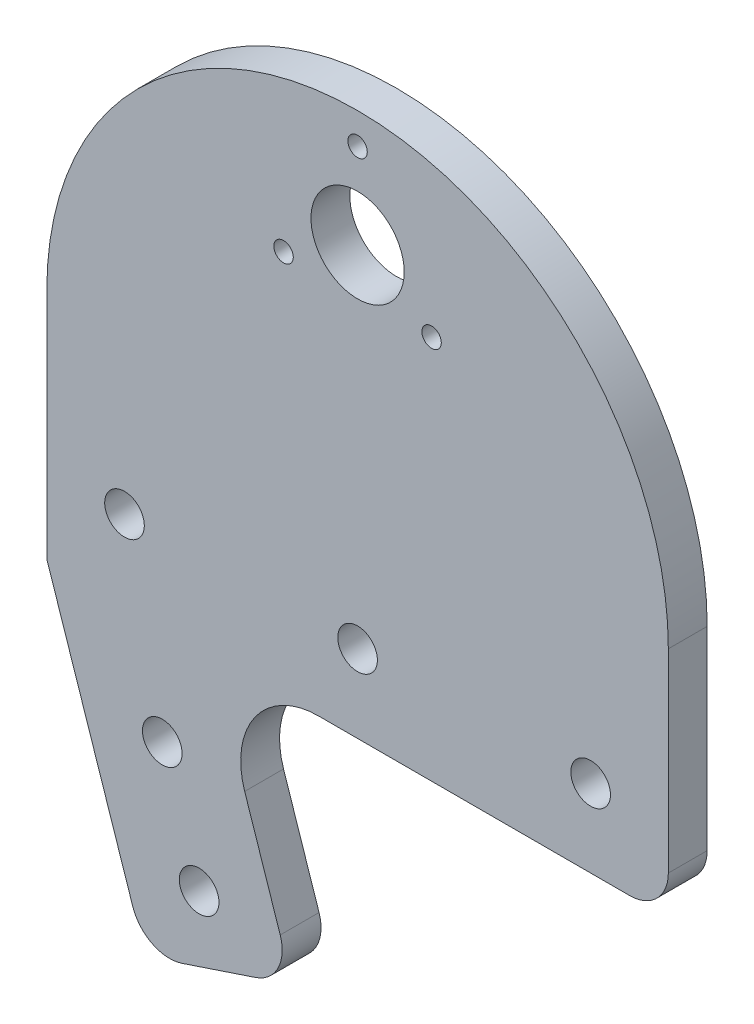
ISO-10303-21;
HEADER;
FILE_DESCRIPTION(('STEP AP214'),'2;1');
FILE_NAME('part.step','',(''),(''),'','','');
FILE_SCHEMA(('AUTOMOTIVE_DESIGN { 1 0 10303 214 1 1 1 1 }'));
ENDSEC;
DATA;
#1=APPLICATION_CONTEXT('core data for automotive mechanical design processes');
#2=APPLICATION_PROTOCOL_DEFINITION('international standard','automotive_design',2000,#1);
#3=PRODUCT_CONTEXT('',#1,'mechanical');
#4=PRODUCT('Part','Part','',(#3));
#5=PRODUCT_RELATED_PRODUCT_CATEGORY('part','',(#4));
#6=PRODUCT_DEFINITION_FORMATION('','',#4);
#7=PRODUCT_DEFINITION_CONTEXT('part definition',#1,'design');
#8=PRODUCT_DEFINITION('design','',#6,#7);
#9=PRODUCT_DEFINITION_SHAPE('','',#8);
#10=(LENGTH_UNIT() NAMED_UNIT(*) SI_UNIT(.MILLI.,.METRE.));
#11=(NAMED_UNIT(*) PLANE_ANGLE_UNIT() SI_UNIT($,.RADIAN.));
#12=(NAMED_UNIT(*) SI_UNIT($,.STERADIAN.) SOLID_ANGLE_UNIT());
#13=UNCERTAINTY_MEASURE_WITH_UNIT(LENGTH_MEASURE(1.E-05),#10,'distance_accuracy_value','');
#14=(GEOMETRIC_REPRESENTATION_CONTEXT(3) GLOBAL_UNCERTAINTY_ASSIGNED_CONTEXT((#13)) GLOBAL_UNIT_ASSIGNED_CONTEXT((#10,
#11,#12)) REPRESENTATION_CONTEXT('',''));
#15=CARTESIAN_POINT('',(0.,0.,0.));
#16=DIRECTION('',(0.,0.,1.));
#17=DIRECTION('',(1.,0.,0.));
#18=AXIS2_PLACEMENT_3D('',#15,#16,#17);
#19=CARTESIAN_POINT('',(-40.,-55.,5.));
#20=DIRECTION('',(0.,1.,0.));
#21=DIRECTION('',(-1.,0.,0.));
#22=AXIS2_PLACEMENT_3D('',#19,#20,#21);
#23=PLANE('',#22);
#24=DIRECTION('',(1.,0.,0.));
#25=VECTOR('',#24,1.);
#26=CARTESIAN_POINT('',(-40.,-55.,0.));
#27=LINE('',#26,#25);
#28=CARTESIAN_POINT('',(-5.04389006498376,-55.,0.));
#29=VERTEX_POINT('',#28);
#30=CARTESIAN_POINT('',(35.,-55.,0.));
#31=VERTEX_POINT('',#30);
#32=EDGE_CURVE('E207',#29,#31,#27,.T.);
#33=ORIENTED_EDGE('',*,*,#32,.T.);
#34=DIRECTION('',(0.,0.,-1.));
#35=VECTOR('',#34,1.);
#36=CARTESIAN_POINT('',(35.,-55.,5.));
#37=LINE('',#36,#35);
#38=CARTESIAN_POINT('',(35.,-55.,5.));
#39=VERTEX_POINT('',#38);
#40=EDGE_CURVE('E234',#31,#39,#37,.F.);
#41=ORIENTED_EDGE('',*,*,#40,.T.);
#42=DIRECTION('',(1.,0.,0.));
#43=VECTOR('',#42,1.);
#44=CARTESIAN_POINT('',(-40.,-55.,5.));
#45=LINE('',#44,#43);
#46=CARTESIAN_POINT('',(-5.04389006498376,-55.,5.));
#47=VERTEX_POINT('',#46);
#48=EDGE_CURVE('E132',#47,#39,#45,.T.);
#49=ORIENTED_EDGE('',*,*,#48,.F.);
#50=DIRECTION('',(0.,0.,1.));
#51=VECTOR('',#50,1.);
#52=CARTESIAN_POINT('',(-5.04389006498376,-55.,5.));
#53=LINE('',#52,#51);
#54=EDGE_CURVE('E218',#47,#29,#53,.F.);
#55=ORIENTED_EDGE('',*,*,#54,.T.);
#56=EDGE_LOOP('',(#33,#41,#49,#55));
#57=FACE_BOUND('',#56,.T.);
#58=ADVANCED_FACE('F38',(#57),#23,.F.);
#59=CARTESIAN_POINT('',(0.,-25.,5.));
#60=DIRECTION('',(0.,0.,-1.));
#61=DIRECTION('',(-1.,0.,0.));
#62=AXIS2_PLACEMENT_3D('',#59,#60,#61);
#63=PLANE('',#62);
#64=CARTESIAN_POINT('',(0.,11.,5.));
#65=DIRECTION('',(0.,0.,1.));
#66=DIRECTION('',(1.,0.,0.));
#67=AXIS2_PLACEMENT_3D('',#64,#65,#66);
#68=CIRCLE('',#67,1.25);
#69=CARTESIAN_POINT('',(1.25,11.,5.));
#70=VERTEX_POINT('',#69);
#71=EDGE_CURVE('E362',#70,#70,#68,.T.);
#72=ORIENTED_EDGE('',*,*,#71,.F.);
#73=EDGE_LOOP('',(#72));
#74=FACE_BOUND('',#73,.T.);
#75=CARTESIAN_POINT('',(9.52627944162906,-5.49999999999986,5.));
#76=DIRECTION('',(0.,0.,1.));
#77=DIRECTION('',(1.,0.,0.));
#78=AXIS2_PLACEMENT_3D('',#75,#76,#77);
#79=CIRCLE('',#78,1.25000000000024);
#80=CARTESIAN_POINT('',(10.7762794416293,-5.49999999999986,5.));
#81=VERTEX_POINT('',#80);
#82=EDGE_CURVE('E367',#81,#81,#79,.T.);
#83=ORIENTED_EDGE('',*,*,#82,.F.);
#84=EDGE_LOOP('',(#83));
#85=FACE_BOUND('',#84,.T.);
#86=CARTESIAN_POINT('',(-9.52627944162859,-5.50000000000014,5.));
#87=DIRECTION('',(0.,0.,1.));
#88=DIRECTION('',(1.,0.,0.));
#89=AXIS2_PLACEMENT_3D('',#86,#87,#88);
#90=CIRCLE('',#89,1.25000000000036);
#91=CARTESIAN_POINT('',(-8.27627944162823,-5.50000000000014,5.));
#92=VERTEX_POINT('',#91);
#93=EDGE_CURVE('E157',#92,#92,#90,.T.);
#94=ORIENTED_EDGE('',*,*,#93,.F.);
#95=EDGE_LOOP('',(#94));
#96=FACE_BOUND('',#95,.T.);
#97=ORIENTED_EDGE('',*,*,#48,.T.);
#98=CARTESIAN_POINT('',(35.,-50.,5.));
#99=DIRECTION('',(0.,0.,-1.));
#100=DIRECTION('',(-1.,0.,0.));
#101=AXIS2_PLACEMENT_3D('',#98,#99,#100);
#102=CIRCLE('',#101,5.);
#103=CARTESIAN_POINT('',(40.,-50.,5.));
#104=VERTEX_POINT('',#103);
#105=EDGE_CURVE('E239',#39,#104,#102,.F.);
#106=ORIENTED_EDGE('',*,*,#105,.T.);
#107=DIRECTION('',(0.,1.,0.));
#108=VECTOR('',#107,1.);
#109=CARTESIAN_POINT('',(40.,-25.,5.));
#110=LINE('',#109,#108);
#111=CARTESIAN_POINT('',(40.,-25.,5.));
#112=VERTEX_POINT('',#111);
#113=EDGE_CURVE('E202',#104,#112,#110,.T.);
#114=ORIENTED_EDGE('',*,*,#113,.T.);
#115=CARTESIAN_POINT('',(0.,-25.,5.));
#116=DIRECTION('',(0.,0.,1.));
#117=DIRECTION('',(-1.,0.,0.));
#118=AXIS2_PLACEMENT_3D('',#115,#116,#117);
#119=CIRCLE('',#118,40.);
#120=CARTESIAN_POINT('',(-40.,-25.,5.));
#121=VERTEX_POINT('',#120);
#122=EDGE_CURVE('E128',#112,#121,#119,.T.);
#123=ORIENTED_EDGE('',*,*,#122,.T.);
#124=DIRECTION('',(0.,-1.,0.));
#125=VECTOR('',#124,1.);
#126=CARTESIAN_POINT('',(-40.,-25.,5.));
#127=LINE('',#126,#125);
#128=CARTESIAN_POINT('',(-40.,-55.,5.));
#129=VERTEX_POINT('',#128);
#130=EDGE_CURVE('E120',#121,#129,#127,.T.);
#131=ORIENTED_EDGE('',*,*,#130,.T.);
#132=DIRECTION('',(0.31622776601683,-0.948683298050516,0.));
#133=VECTOR('',#132,1.);
#134=CARTESIAN_POINT('',(-27.3508893593268,-92.9473319220206,5.));
#135=LINE('',#134,#133);
#136=CARTESIAN_POINT('',(-28.932028189411,-88.203915431768,5.));
#137=VERTEX_POINT('',#136);
#138=EDGE_CURVE('E126',#129,#137,#135,.T.);
#139=ORIENTED_EDGE('',*,*,#138,.T.);
#140=CARTESIAN_POINT('',(-24.1886116991584,-86.6227766016839,5.));
#141=DIRECTION('',(0.,0.,-1.));
#142=DIRECTION('',(-1.,0.,0.));
#143=AXIS2_PLACEMENT_3D('',#140,#141,#142);
#144=CIRCLE('',#143,5.);
#145=CARTESIAN_POINT('',(-22.6074728690742,-91.3661930919364,5.));
#146=VERTEX_POINT('',#145);
#147=EDGE_CURVE('E236',#137,#146,#144,.F.);
#148=ORIENTED_EDGE('',*,*,#147,.T.);
#149=DIRECTION('',(0.948683298050514,0.316227766016837,0.));
#150=VECTOR('',#149,1.);
#151=CARTESIAN_POINT('',(-27.3508893593268,-92.9473319220206,5.));
#152=LINE('',#151,#150);
#153=CARTESIAN_POINT('',(-13.1206398885696,-88.2039154317683,5.));
#154=VERTEX_POINT('',#153);
#155=EDGE_CURVE('E154',#146,#154,#152,.T.);
#156=ORIENTED_EDGE('',*,*,#155,.T.);
#157=CARTESIAN_POINT('',(-14.7017787186538,-83.4604989415157,5.));
#158=DIRECTION('',(0.,0.,-1.));
#159=DIRECTION('',(-1.,0.,0.));
#160=AXIS2_PLACEMENT_3D('',#157,#158,#159);
#161=CIRCLE('',#160,5.);
#162=CARTESIAN_POINT('',(-9.95836222840121,-81.8793601114315,5.));
#163=VERTEX_POINT('',#162);
#164=EDGE_CURVE('E53',#154,#163,#161,.F.);
#165=ORIENTED_EDGE('',*,*,#164,.T.);
#166=DIRECTION('',(-0.316227766016837,0.948683298050514,0.));
#167=VECTOR('',#166,1.);
#168=CARTESIAN_POINT('',(-8.37722339831702,-86.6227766016841,5.));
#169=LINE('',#168,#167);
#170=CARTESIAN_POINT('',(-14.5307230454889,-68.1622776601683,5.));
#171=VERTEX_POINT('',#170);
#172=EDGE_CURVE('E149',#163,#171,#169,.T.);
#173=ORIENTED_EDGE('',*,*,#172,.T.);
#174=CARTESIAN_POINT('',(-5.04389006498377,-65.,5.));
#175=DIRECTION('',(0.,0.,-1.));
#176=DIRECTION('',(-1.,0.,0.));
#177=AXIS2_PLACEMENT_3D('',#174,#175,#176);
#178=CIRCLE('',#177,10.);
#179=EDGE_CURVE('E220',#171,#47,#178,.T.);
#180=ORIENTED_EDGE('',*,*,#179,.T.);
#181=EDGE_LOOP('',(#97,#106,#114,#123,#131,#139,#148,#156,#165,#173,#180));
#182=FACE_BOUND('',#181,.T.);
#183=CARTESIAN_POINT('',(0.,0.,5.));
#184=DIRECTION('',(0.,0.,1.));
#185=DIRECTION('',(1.,0.,0.));
#186=AXIS2_PLACEMENT_3D('',#183,#184,#185);
#187=CIRCLE('',#186,6.);
#188=CARTESIAN_POINT('',(6.,0.,5.));
#189=VERTEX_POINT('',#188);
#190=EDGE_CURVE('E196',#189,#189,#187,.T.);
#191=ORIENTED_EDGE('',*,*,#190,.F.);
#192=EDGE_LOOP('',(#191));
#193=FACE_BOUND('',#192,.T.);
#194=CARTESIAN_POINT('',(0.,-45.,5.));
#195=DIRECTION('',(0.,0.,1.));
#196=DIRECTION('',(1.,0.,0.));
#197=AXIS2_PLACEMENT_3D('',#194,#195,#196);
#198=CIRCLE('',#197,2.55);
#199=CARTESIAN_POINT('',(2.55000000000001,-45.,5.));
#200=VERTEX_POINT('',#199);
#201=EDGE_CURVE('E190',#200,#200,#198,.T.);
#202=ORIENTED_EDGE('',*,*,#201,.F.);
#203=EDGE_LOOP('',(#202));
#204=FACE_BOUND('',#203,.T.);
#205=CARTESIAN_POINT('',(-30.,-45.,5.));
#206=DIRECTION('',(0.,0.,1.));
#207=DIRECTION('',(1.,0.,0.));
#208=AXIS2_PLACEMENT_3D('',#205,#206,#207);
#209=CIRCLE('',#208,2.54999999999999);
#210=CARTESIAN_POINT('',(-27.45,-45.,5.));
#211=VERTEX_POINT('',#210);
#212=EDGE_CURVE('E184',#211,#211,#209,.T.);
#213=ORIENTED_EDGE('',*,*,#212,.F.);
#214=EDGE_LOOP('',(#213));
#215=FACE_BOUND('',#214,.T.);
#216=CARTESIAN_POINT('',(30.,-45.,5.));
#217=DIRECTION('',(0.,0.,1.));
#218=DIRECTION('',(1.,0.,0.));
#219=AXIS2_PLACEMENT_3D('',#216,#217,#218);
#220=CIRCLE('',#219,2.55);
#221=CARTESIAN_POINT('',(32.55,-45.,5.));
#222=VERTEX_POINT('',#221);
#223=EDGE_CURVE('E178',#222,#222,#220,.T.);
#224=ORIENTED_EDGE('',*,*,#223,.F.);
#225=EDGE_LOOP('',(#224));
#226=FACE_BOUND('',#225,.T.);
#227=CARTESIAN_POINT('',(-25.1372949972092,-67.9653384066905,5.));
#228=DIRECTION('',(0.,0.,1.));
#229=DIRECTION('',(1.,0.,0.));
#230=AXIS2_PLACEMENT_3D('',#227,#228,#229);
#231=CIRCLE('',#230,2.54999999999999);
#232=CARTESIAN_POINT('',(-22.5872949972092,-67.9653384066905,5.));
#233=VERTEX_POINT('',#232);
#234=EDGE_CURVE('E161',#233,#233,#231,.T.);
#235=ORIENTED_EDGE('',*,*,#234,.F.);
#236=EDGE_LOOP('',(#235));
#237=FACE_BOUND('',#236,.T.);
#238=CARTESIAN_POINT('',(-20.3938785069566,-82.1955878774482,5.));
#239=DIRECTION('',(0.,0.,1.));
#240=DIRECTION('',(1.,0.,0.));
#241=AXIS2_PLACEMENT_3D('',#238,#239,#240);
#242=CIRCLE('',#241,2.54999999999999);
#243=CARTESIAN_POINT('',(-17.8438785069566,-82.1955878774482,5.));
#244=VERTEX_POINT('',#243);
#245=EDGE_CURVE('E162',#244,#244,#242,.T.);
#246=ORIENTED_EDGE('',*,*,#245,.F.);
#247=EDGE_LOOP('',(#246));
#248=FACE_BOUND('',#247,.T.);
#249=ADVANCED_FACE('F123',(#74,#85,#96,#182,#193,#204,#215,#226,#237,#248),#63,.F.);
#250=CARTESIAN_POINT('',(0.,-25.,0.));
#251=DIRECTION('',(0.,0.,-1.));
#252=DIRECTION('',(-1.,0.,0.));
#253=AXIS2_PLACEMENT_3D('',#250,#251,#252);
#254=PLANE('',#253);
#255=CARTESIAN_POINT('',(0.,11.,0.));
#256=DIRECTION('',(0.,0.,1.));
#257=DIRECTION('',(1.,0.,0.));
#258=AXIS2_PLACEMENT_3D('',#255,#256,#257);
#259=CIRCLE('',#258,1.25);
#260=CARTESIAN_POINT('',(1.25,11.,0.));
#261=VERTEX_POINT('',#260);
#262=EDGE_CURVE('E176',#261,#261,#259,.T.);
#263=ORIENTED_EDGE('',*,*,#262,.T.);
#264=EDGE_LOOP('',(#263));
#265=FACE_BOUND('',#264,.T.);
#266=CARTESIAN_POINT('',(9.52627944162906,-5.49999999999986,0.));
#267=DIRECTION('',(0.,0.,1.));
#268=DIRECTION('',(1.,0.,0.));
#269=AXIS2_PLACEMENT_3D('',#266,#267,#268);
#270=CIRCLE('',#269,1.25000000000024);
#271=CARTESIAN_POINT('',(10.7762794416293,-5.49999999999986,0.));
#272=VERTEX_POINT('',#271);
#273=EDGE_CURVE('E363',#272,#272,#270,.T.);
#274=ORIENTED_EDGE('',*,*,#273,.T.);
#275=EDGE_LOOP('',(#274));
#276=FACE_BOUND('',#275,.T.);
#277=CARTESIAN_POINT('',(-9.52627944162859,-5.50000000000014,0.));
#278=DIRECTION('',(0.,0.,1.));
#279=DIRECTION('',(1.,0.,0.));
#280=AXIS2_PLACEMENT_3D('',#277,#278,#279);
#281=CIRCLE('',#280,1.25000000000036);
#282=CARTESIAN_POINT('',(-8.27627944162823,-5.50000000000014,0.));
#283=VERTEX_POINT('',#282);
#284=EDGE_CURVE('E371',#283,#283,#281,.T.);
#285=ORIENTED_EDGE('',*,*,#284,.T.);
#286=EDGE_LOOP('',(#285));
#287=FACE_BOUND('',#286,.T.);
#288=CARTESIAN_POINT('',(-30.,-45.,0.));
#289=DIRECTION('',(0.,0.,1.));
#290=DIRECTION('',(1.,0.,0.));
#291=AXIS2_PLACEMENT_3D('',#288,#289,#290);
#292=CIRCLE('',#291,2.54999999999999);
#293=CARTESIAN_POINT('',(-27.45,-45.,0.));
#294=VERTEX_POINT('',#293);
#295=EDGE_CURVE('E181',#294,#294,#292,.T.);
#296=ORIENTED_EDGE('',*,*,#295,.T.);
#297=EDGE_LOOP('',(#296));
#298=FACE_BOUND('',#297,.T.);
#299=CARTESIAN_POINT('',(0.,0.,0.));
#300=DIRECTION('',(0.,0.,1.));
#301=DIRECTION('',(1.,0.,0.));
#302=AXIS2_PLACEMENT_3D('',#299,#300,#301);
#303=CIRCLE('',#302,6.);
#304=CARTESIAN_POINT('',(6.,0.,0.));
#305=VERTEX_POINT('',#304);
#306=EDGE_CURVE('E193',#305,#305,#303,.T.);
#307=ORIENTED_EDGE('',*,*,#306,.T.);
#308=EDGE_LOOP('',(#307));
#309=FACE_BOUND('',#308,.T.);
#310=DIRECTION('',(0.,1.,0.));
#311=VECTOR('',#310,1.);
#312=CARTESIAN_POINT('',(40.,-25.,0.));
#313=LINE('',#312,#311);
#314=CARTESIAN_POINT('',(40.,-50.,0.));
#315=VERTEX_POINT('',#314);
#316=CARTESIAN_POINT('',(40.,-25.,0.));
#317=VERTEX_POINT('',#316);
#318=EDGE_CURVE('E210',#315,#317,#313,.T.);
#319=ORIENTED_EDGE('',*,*,#318,.F.);
#320=CARTESIAN_POINT('',(35.,-50.,0.));
#321=DIRECTION('',(0.,0.,-1.));
#322=DIRECTION('',(-1.,0.,0.));
#323=AXIS2_PLACEMENT_3D('',#320,#321,#322);
#324=CIRCLE('',#323,5.);
#325=EDGE_CURVE('E232',#315,#31,#324,.T.);
#326=ORIENTED_EDGE('',*,*,#325,.T.);
#327=ORIENTED_EDGE('',*,*,#32,.F.);
#328=CARTESIAN_POINT('',(-5.04389006498377,-65.,0.));
#329=DIRECTION('',(0.,0.,-1.));
#330=DIRECTION('',(-1.,0.,0.));
#331=AXIS2_PLACEMENT_3D('',#328,#329,#330);
#332=CIRCLE('',#331,10.);
#333=CARTESIAN_POINT('',(-14.5307230454889,-68.1622776601683,0.));
#334=VERTEX_POINT('',#333);
#335=EDGE_CURVE('E222',#29,#334,#332,.F.);
#336=ORIENTED_EDGE('',*,*,#335,.T.);
#337=DIRECTION('',(-0.316227766016837,0.948683298050514,0.));
#338=VECTOR('',#337,1.);
#339=CARTESIAN_POINT('',(-8.37722339831702,-86.6227766016841,0.));
#340=LINE('',#339,#338);
#341=CARTESIAN_POINT('',(-9.95836222840121,-81.8793601114315,0.));
#342=VERTEX_POINT('',#341);
#343=EDGE_CURVE('E165',#342,#334,#340,.T.);
#344=ORIENTED_EDGE('',*,*,#343,.F.);
#345=CARTESIAN_POINT('',(-14.7017787186538,-83.4604989415157,0.));
#346=DIRECTION('',(0.,0.,-1.));
#347=DIRECTION('',(-1.,0.,0.));
#348=AXIS2_PLACEMENT_3D('',#345,#346,#347);
#349=CIRCLE('',#348,5.);
#350=CARTESIAN_POINT('',(-13.1206398885696,-88.2039154317683,0.));
#351=VERTEX_POINT('',#350);
#352=EDGE_CURVE('E230',#342,#351,#349,.T.);
#353=ORIENTED_EDGE('',*,*,#352,.T.);
#354=DIRECTION('',(0.948683298050514,0.316227766016837,0.));
#355=VECTOR('',#354,1.);
#356=CARTESIAN_POINT('',(-27.3508893593268,-92.9473319220206,0.));
#357=LINE('',#356,#355);
#358=CARTESIAN_POINT('',(-22.6074728690742,-91.3661930919364,0.));
#359=VERTEX_POINT('',#358);
#360=EDGE_CURVE('E173',#359,#351,#357,.T.);
#361=ORIENTED_EDGE('',*,*,#360,.F.);
#362=CARTESIAN_POINT('',(-24.1886116991584,-86.6227766016839,0.));
#363=DIRECTION('',(0.,0.,-1.));
#364=DIRECTION('',(-1.,0.,0.));
#365=AXIS2_PLACEMENT_3D('',#362,#363,#364);
#366=CIRCLE('',#365,5.);
#367=CARTESIAN_POINT('',(-28.932028189411,-88.203915431768,0.));
#368=VERTEX_POINT('',#367);
#369=EDGE_CURVE('E228',#359,#368,#366,.T.);
#370=ORIENTED_EDGE('',*,*,#369,.T.);
#371=DIRECTION('',(0.31622776601683,-0.948683298050517,0.));
#372=VECTOR('',#371,1.);
#373=CARTESIAN_POINT('',(-27.3508893593268,-92.9473319220206,0.));
#374=LINE('',#373,#372);
#375=CARTESIAN_POINT('',(-40.,-55.,0.));
#376=VERTEX_POINT('',#375);
#377=EDGE_CURVE('E172',#376,#368,#374,.T.);
#378=ORIENTED_EDGE('',*,*,#377,.F.);
#379=DIRECTION('',(0.,-1.,0.));
#380=VECTOR('',#379,1.);
#381=CARTESIAN_POINT('',(-40.,-25.,0.));
#382=LINE('',#381,#380);
#383=CARTESIAN_POINT('',(-40.,-25.,0.));
#384=VERTEX_POINT('',#383);
#385=EDGE_CURVE('E139',#384,#376,#382,.T.);
#386=ORIENTED_EDGE('',*,*,#385,.F.);
#387=CARTESIAN_POINT('',(0.,-25.,0.));
#388=DIRECTION('',(0.,0.,1.));
#389=DIRECTION('',(-1.,0.,0.));
#390=AXIS2_PLACEMENT_3D('',#387,#388,#389);
#391=CIRCLE('',#390,40.);
#392=EDGE_CURVE('E133',#317,#384,#391,.T.);
#393=ORIENTED_EDGE('',*,*,#392,.F.);
#394=EDGE_LOOP('',(#319,#326,#327,#336,#344,#353,#361,#370,#378,#386,#393));
#395=FACE_BOUND('',#394,.T.);
#396=CARTESIAN_POINT('',(0.,-45.,0.));
#397=DIRECTION('',(0.,0.,1.));
#398=DIRECTION('',(1.,0.,0.));
#399=AXIS2_PLACEMENT_3D('',#396,#397,#398);
#400=CIRCLE('',#399,2.55);
#401=CARTESIAN_POINT('',(2.55000000000001,-45.,0.));
#402=VERTEX_POINT('',#401);
#403=EDGE_CURVE('E187',#402,#402,#400,.T.);
#404=ORIENTED_EDGE('',*,*,#403,.T.);
#405=EDGE_LOOP('',(#404));
#406=FACE_BOUND('',#405,.T.);
#407=CARTESIAN_POINT('',(30.,-45.,0.));
#408=DIRECTION('',(0.,0.,1.));
#409=DIRECTION('',(1.,0.,0.));
#410=AXIS2_PLACEMENT_3D('',#407,#408,#409);
#411=CIRCLE('',#410,2.55);
#412=CARTESIAN_POINT('',(32.55,-45.,0.));
#413=VERTEX_POINT('',#412);
#414=EDGE_CURVE('E169',#413,#413,#411,.T.);
#415=ORIENTED_EDGE('',*,*,#414,.T.);
#416=EDGE_LOOP('',(#415));
#417=FACE_BOUND('',#416,.T.);
#418=CARTESIAN_POINT('',(-25.1372949972092,-67.9653384066905,0.));
#419=DIRECTION('',(0.,0.,-1.));
#420=DIRECTION('',(-1.,0.,0.));
#421=AXIS2_PLACEMENT_3D('',#418,#419,#420);
#422=CIRCLE('',#421,2.54999999999999);
#423=CARTESIAN_POINT('',(-27.6872949972092,-67.9653384066905,0.));
#424=VERTEX_POINT('',#423);
#425=EDGE_CURVE('E148',#424,#424,#422,.F.);
#426=ORIENTED_EDGE('',*,*,#425,.T.);
#427=EDGE_LOOP('',(#426));
#428=FACE_BOUND('',#427,.T.);
#429=CARTESIAN_POINT('',(-20.3938785069566,-82.1955878774482,0.));
#430=DIRECTION('',(0.,0.,-1.));
#431=DIRECTION('',(-1.,0.,0.));
#432=AXIS2_PLACEMENT_3D('',#429,#430,#431);
#433=CIRCLE('',#432,2.54999999999999);
#434=CARTESIAN_POINT('',(-22.9438785069566,-82.1955878774482,0.));
#435=VERTEX_POINT('',#434);
#436=EDGE_CURVE('E152',#435,#435,#433,.F.);
#437=ORIENTED_EDGE('',*,*,#436,.T.);
#438=EDGE_LOOP('',(#437));
#439=FACE_BOUND('',#438,.T.);
#440=ADVANCED_FACE('F250',(#265,#276,#287,#298,#309,#395,#406,#417,#428,#439),#254,.T.);
#441=CARTESIAN_POINT('',(-40.,-25.,5.));
#442=DIRECTION('',(1.,0.,0.));
#443=DIRECTION('',(0.,0.,-1.));
#444=AXIS2_PLACEMENT_3D('',#441,#442,#443);
#445=PLANE('',#444);
#446=ORIENTED_EDGE('',*,*,#385,.T.);
#447=DIRECTION('',(0.,0.,-1.));
#448=VECTOR('',#447,1.);
#449=CARTESIAN_POINT('',(-40.,-55.,5.));
#450=LINE('',#449,#448);
#451=EDGE_CURVE('E136',#129,#376,#450,.T.);
#452=ORIENTED_EDGE('',*,*,#451,.F.);
#453=ORIENTED_EDGE('',*,*,#130,.F.);
#454=DIRECTION('',(0.,0.,-1.));
#455=VECTOR('',#454,1.);
#456=CARTESIAN_POINT('',(-40.,-25.,5.));
#457=LINE('',#456,#455);
#458=EDGE_CURVE('E205',#121,#384,#457,.T.);
#459=ORIENTED_EDGE('',*,*,#458,.T.);
#460=EDGE_LOOP('',(#446,#452,#453,#459));
#461=FACE_BOUND('',#460,.T.);
#462=ADVANCED_FACE('F137',(#461),#445,.F.);
#463=CARTESIAN_POINT('',(40.,-25.,5.));
#464=DIRECTION('',(-1.,0.,0.));
#465=DIRECTION('',(0.,-1.,0.));
#466=AXIS2_PLACEMENT_3D('',#463,#464,#465);
#467=PLANE('',#466);
#468=ORIENTED_EDGE('',*,*,#113,.F.);
#469=DIRECTION('',(0.,0.,-1.));
#470=VECTOR('',#469,1.);
#471=CARTESIAN_POINT('',(40.,-50.,5.));
#472=LINE('',#471,#470);
#473=EDGE_CURVE('E225',#104,#315,#472,.T.);
#474=ORIENTED_EDGE('',*,*,#473,.T.);
#475=ORIENTED_EDGE('',*,*,#318,.T.);
#476=DIRECTION('',(0.,0.,-1.));
#477=VECTOR('',#476,1.);
#478=CARTESIAN_POINT('',(40.,-25.,5.));
#479=LINE('',#478,#477);
#480=EDGE_CURVE('E144',#112,#317,#479,.T.);
#481=ORIENTED_EDGE('',*,*,#480,.F.);
#482=EDGE_LOOP('',(#468,#474,#475,#481));
#483=FACE_BOUND('',#482,.T.);
#484=ADVANCED_FACE('F269',(#483),#467,.F.);
#485=CARTESIAN_POINT('',(0.,-25.,5.));
#486=DIRECTION('',(0.,0.,-1.));
#487=DIRECTION('',(-1.,0.,0.));
#488=AXIS2_PLACEMENT_3D('',#485,#486,#487);
#489=CYLINDRICAL_SURFACE('',#488,40.);
#490=ORIENTED_EDGE('',*,*,#392,.T.);
#491=ORIENTED_EDGE('',*,*,#458,.F.);
#492=ORIENTED_EDGE('',*,*,#122,.F.);
#493=ORIENTED_EDGE('',*,*,#480,.T.);
#494=EDGE_LOOP('',(#490,#491,#492,#493));
#495=FACE_BOUND('',#494,.T.);
#496=ADVANCED_FACE('F265',(#495),#489,.T.);
#497=CARTESIAN_POINT('',(0.,0.,5.));
#498=DIRECTION('',(0.,0.,-1.));
#499=DIRECTION('',(-1.,0.,0.));
#500=AXIS2_PLACEMENT_3D('',#497,#498,#499);
#501=CYLINDRICAL_SURFACE('',#500,6.);
#502=ORIENTED_EDGE('',*,*,#190,.T.);
#503=EDGE_LOOP('',(#502));
#504=FACE_BOUND('',#503,.T.);
#505=ORIENTED_EDGE('',*,*,#306,.F.);
#506=EDGE_LOOP('',(#505));
#507=FACE_BOUND('',#506,.T.);
#508=ADVANCED_FACE('F315',(#504,#507),#501,.F.);
#509=CARTESIAN_POINT('',(0.,-45.,5.));
#510=DIRECTION('',(0.,0.,-1.));
#511=DIRECTION('',(-1.,0.,0.));
#512=AXIS2_PLACEMENT_3D('',#509,#510,#511);
#513=CYLINDRICAL_SURFACE('',#512,2.55);
#514=ORIENTED_EDGE('',*,*,#201,.T.);
#515=EDGE_LOOP('',(#514));
#516=FACE_BOUND('',#515,.T.);
#517=ORIENTED_EDGE('',*,*,#403,.F.);
#518=EDGE_LOOP('',(#517));
#519=FACE_BOUND('',#518,.T.);
#520=ADVANCED_FACE('F319',(#516,#519),#513,.F.);
#521=CARTESIAN_POINT('',(-30.,-45.,5.));
#522=DIRECTION('',(0.,0.,-1.));
#523=DIRECTION('',(-1.,0.,0.));
#524=AXIS2_PLACEMENT_3D('',#521,#522,#523);
#525=CYLINDRICAL_SURFACE('',#524,2.54999999999999);
#526=ORIENTED_EDGE('',*,*,#212,.T.);
#527=EDGE_LOOP('',(#526));
#528=FACE_BOUND('',#527,.T.);
#529=ORIENTED_EDGE('',*,*,#295,.F.);
#530=EDGE_LOOP('',(#529));
#531=FACE_BOUND('',#530,.T.);
#532=ADVANCED_FACE('F324',(#528,#531),#525,.F.);
#533=CARTESIAN_POINT('',(30.,-45.,5.));
#534=DIRECTION('',(0.,0.,-1.));
#535=DIRECTION('',(-1.,0.,0.));
#536=AXIS2_PLACEMENT_3D('',#533,#534,#535);
#537=CYLINDRICAL_SURFACE('',#536,2.55);
#538=ORIENTED_EDGE('',*,*,#223,.T.);
#539=EDGE_LOOP('',(#538));
#540=FACE_BOUND('',#539,.T.);
#541=ORIENTED_EDGE('',*,*,#414,.F.);
#542=EDGE_LOOP('',(#541));
#543=FACE_BOUND('',#542,.T.);
#544=ADVANCED_FACE('F331',(#540,#543),#537,.F.);
#545=CARTESIAN_POINT('',(-27.3508893593268,-92.9473319220206,-49.3963561409138));
#546=DIRECTION('',(0.316227766016837,-0.948683298050514,0.));
#547=DIRECTION('',(0.948683298050514,0.316227766016837,0.));
#548=AXIS2_PLACEMENT_3D('',#545,#546,#547);
#549=PLANE('',#548);
#550=ORIENTED_EDGE('',*,*,#360,.T.);
#551=DIRECTION('',(0.,0.,1.));
#552=VECTOR('',#551,1.);
#553=CARTESIAN_POINT('',(-13.1206398885696,-88.2039154317683,-49.3963561409138));
#554=LINE('',#553,#552);
#555=EDGE_CURVE('E243',#351,#154,#554,.T.);
#556=ORIENTED_EDGE('',*,*,#555,.T.);
#557=ORIENTED_EDGE('',*,*,#155,.F.);
#558=DIRECTION('',(0.,0.,1.));
#559=VECTOR('',#558,1.);
#560=CARTESIAN_POINT('',(-22.6074728690742,-91.3661930919364,-49.3963561409138));
#561=LINE('',#560,#559);
#562=EDGE_CURVE('E241',#146,#359,#561,.F.);
#563=ORIENTED_EDGE('',*,*,#562,.T.);
#564=EDGE_LOOP('',(#550,#556,#557,#563));
#565=FACE_BOUND('',#564,.T.);
#566=ADVANCED_FACE('F259',(#565),#549,.T.);
#567=CARTESIAN_POINT('',(-27.3508893593268,-92.9473319220206,-49.3963561409138));
#568=DIRECTION('',(-0.948683298050517,-0.31622776601683,0.));
#569=DIRECTION('',(0.31622776601683,-0.948683298050517,0.));
#570=AXIS2_PLACEMENT_3D('',#567,#568,#569);
#571=PLANE('',#570);
#572=ORIENTED_EDGE('',*,*,#377,.T.);
#573=DIRECTION('',(0.,0.,1.));
#574=VECTOR('',#573,1.);
#575=CARTESIAN_POINT('',(-28.932028189411,-88.203915431768,-49.3963561409138));
#576=LINE('',#575,#574);
#577=EDGE_CURVE('E11',#368,#137,#576,.T.);
#578=ORIENTED_EDGE('',*,*,#577,.T.);
#579=ORIENTED_EDGE('',*,*,#138,.F.);
#580=ORIENTED_EDGE('',*,*,#451,.T.);
#581=EDGE_LOOP('',(#572,#578,#579,#580));
#582=FACE_BOUND('',#581,.T.);
#583=ADVANCED_FACE('F146',(#582),#571,.T.);
#584=CARTESIAN_POINT('',(-8.37722339831702,-86.6227766016841,-49.3963561409138));
#585=DIRECTION('',(0.948683298050514,0.316227766016837,0.));
#586=DIRECTION('',(-0.316227766016837,0.948683298050514,0.));
#587=AXIS2_PLACEMENT_3D('',#584,#585,#586);
#588=PLANE('',#587);
#589=ORIENTED_EDGE('',*,*,#172,.F.);
#590=DIRECTION('',(0.,0.,1.));
#591=VECTOR('',#590,1.);
#592=CARTESIAN_POINT('',(-9.95836222840121,-81.8793601114315,-49.3963561409138));
#593=LINE('',#592,#591);
#594=EDGE_CURVE('E46',#163,#342,#593,.F.);
#595=ORIENTED_EDGE('',*,*,#594,.T.);
#596=ORIENTED_EDGE('',*,*,#343,.T.);
#597=DIRECTION('',(0.,0.,1.));
#598=VECTOR('',#597,1.);
#599=CARTESIAN_POINT('',(-14.5307230454889,-68.1622776601683,-49.3963561409138));
#600=LINE('',#599,#598);
#601=EDGE_CURVE('E143',#334,#171,#600,.T.);
#602=ORIENTED_EDGE('',*,*,#601,.T.);
#603=EDGE_LOOP('',(#589,#595,#596,#602));
#604=FACE_BOUND('',#603,.T.);
#605=ADVANCED_FACE('F246',(#604),#588,.T.);
#606=CARTESIAN_POINT('',(-20.3938785069566,-82.1955878774482,-49.3963561409138));
#607=DIRECTION('',(0.,0.,1.));
#608=DIRECTION('',(1.,0.,0.));
#609=AXIS2_PLACEMENT_3D('',#606,#607,#608);
#610=CYLINDRICAL_SURFACE('',#609,2.54999999999999);
#611=ORIENTED_EDGE('',*,*,#245,.T.);
#612=EDGE_LOOP('',(#611));
#613=FACE_BOUND('',#612,.T.);
#614=ORIENTED_EDGE('',*,*,#436,.F.);
#615=EDGE_LOOP('',(#614));
#616=FACE_BOUND('',#615,.T.);
#617=ADVANCED_FACE('F289',(#613,#616),#610,.F.);
#618=CARTESIAN_POINT('',(-25.1372949972092,-67.9653384066905,-49.3963561409138));
#619=DIRECTION('',(0.,0.,1.));
#620=DIRECTION('',(1.,0.,0.));
#621=AXIS2_PLACEMENT_3D('',#618,#619,#620);
#622=CYLINDRICAL_SURFACE('',#621,2.54999999999999);
#623=ORIENTED_EDGE('',*,*,#234,.T.);
#624=EDGE_LOOP('',(#623));
#625=FACE_BOUND('',#624,.T.);
#626=ORIENTED_EDGE('',*,*,#425,.F.);
#627=EDGE_LOOP('',(#626));
#628=FACE_BOUND('',#627,.T.);
#629=ADVANCED_FACE('F282',(#625,#628),#622,.F.);
#630=CARTESIAN_POINT('',(-5.04389006498377,-65.,-49.3963561409138));
#631=DIRECTION('',(0.,0.,1.));
#632=DIRECTION('',(1.,0.,0.));
#633=AXIS2_PLACEMENT_3D('',#630,#631,#632);
#634=CYLINDRICAL_SURFACE('',#633,10.);
#635=ORIENTED_EDGE('',*,*,#335,.F.);
#636=ORIENTED_EDGE('',*,*,#54,.F.);
#637=ORIENTED_EDGE('',*,*,#179,.F.);
#638=ORIENTED_EDGE('',*,*,#601,.F.);
#639=EDGE_LOOP('',(#635,#636,#637,#638));
#640=FACE_BOUND('',#639,.T.);
#641=ADVANCED_FACE('F280',(#640),#634,.F.);
#642=CARTESIAN_POINT('',(35.,-50.,5.));
#643=DIRECTION('',(0.,0.,-1.));
#644=DIRECTION('',(-1.,0.,0.));
#645=AXIS2_PLACEMENT_3D('',#642,#643,#644);
#646=CYLINDRICAL_SURFACE('',#645,5.);
#647=ORIENTED_EDGE('',*,*,#105,.F.);
#648=ORIENTED_EDGE('',*,*,#40,.F.);
#649=ORIENTED_EDGE('',*,*,#325,.F.);
#650=ORIENTED_EDGE('',*,*,#473,.F.);
#651=EDGE_LOOP('',(#647,#648,#649,#650));
#652=FACE_BOUND('',#651,.T.);
#653=ADVANCED_FACE('F273',(#652),#646,.T.);
#654=CARTESIAN_POINT('',(-14.7017787186538,-83.4604989415157,-49.3963561409138));
#655=DIRECTION('',(0.,0.,1.));
#656=DIRECTION('',(1.,0.,0.));
#657=AXIS2_PLACEMENT_3D('',#654,#655,#656);
#658=CYLINDRICAL_SURFACE('',#657,5.);
#659=ORIENTED_EDGE('',*,*,#352,.F.);
#660=ORIENTED_EDGE('',*,*,#594,.F.);
#661=ORIENTED_EDGE('',*,*,#164,.F.);
#662=ORIENTED_EDGE('',*,*,#555,.F.);
#663=EDGE_LOOP('',(#659,#660,#661,#662));
#664=FACE_BOUND('',#663,.T.);
#665=ADVANCED_FACE('F256',(#664),#658,.T.);
#666=CARTESIAN_POINT('',(-24.1886116991584,-86.6227766016839,-49.3963561409138));
#667=DIRECTION('',(0.,0.,1.));
#668=DIRECTION('',(1.,0.,0.));
#669=AXIS2_PLACEMENT_3D('',#666,#667,#668);
#670=CYLINDRICAL_SURFACE('',#669,5.);
#671=ORIENTED_EDGE('',*,*,#369,.F.);
#672=ORIENTED_EDGE('',*,*,#562,.F.);
#673=ORIENTED_EDGE('',*,*,#147,.F.);
#674=ORIENTED_EDGE('',*,*,#577,.F.);
#675=EDGE_LOOP('',(#671,#672,#673,#674));
#676=FACE_BOUND('',#675,.T.);
#677=ADVANCED_FACE('F40',(#676),#670,.T.);
#678=CARTESIAN_POINT('',(-9.52627944162859,-5.50000000000014,0.));
#679=DIRECTION('',(0.,0.,1.));
#680=DIRECTION('',(1.,0.,0.));
#681=AXIS2_PLACEMENT_3D('',#678,#679,#680);
#682=CYLINDRICAL_SURFACE('',#681,1.25000000000036);
#683=ORIENTED_EDGE('',*,*,#284,.F.);
#684=EDGE_LOOP('',(#683));
#685=FACE_BOUND('',#684,.T.);
#686=ORIENTED_EDGE('',*,*,#93,.T.);
#687=EDGE_LOOP('',(#686));
#688=FACE_BOUND('',#687,.T.);
#689=ADVANCED_FACE('F345',(#685,#688),#682,.F.);
#690=CARTESIAN_POINT('',(9.52627944162906,-5.49999999999986,0.));
#691=DIRECTION('',(0.,0.,1.));
#692=DIRECTION('',(1.,0.,0.));
#693=AXIS2_PLACEMENT_3D('',#690,#691,#692);
#694=CYLINDRICAL_SURFACE('',#693,1.25000000000024);
#695=ORIENTED_EDGE('',*,*,#273,.F.);
#696=EDGE_LOOP('',(#695));
#697=FACE_BOUND('',#696,.T.);
#698=ORIENTED_EDGE('',*,*,#82,.T.);
#699=EDGE_LOOP('',(#698));
#700=FACE_BOUND('',#699,.T.);
#701=ADVANCED_FACE('F348',(#697,#700),#694,.F.);
#702=CARTESIAN_POINT('',(0.,11.,0.));
#703=DIRECTION('',(0.,0.,1.));
#704=DIRECTION('',(1.,0.,0.));
#705=AXIS2_PLACEMENT_3D('',#702,#703,#704);
#706=CYLINDRICAL_SURFACE('',#705,1.25);
#707=ORIENTED_EDGE('',*,*,#262,.F.);
#708=EDGE_LOOP('',(#707));
#709=FACE_BOUND('',#708,.T.);
#710=ORIENTED_EDGE('',*,*,#71,.T.);
#711=EDGE_LOOP('',(#710));
#712=FACE_BOUND('',#711,.T.);
#713=ADVANCED_FACE('F352',(#709,#712),#706,.F.);
#714=CLOSED_SHELL('',(#58,#249,#440,#462,#484,#496,#508,#520,#532,#544,#566,#583,#605,#617,#629,
#641,#653,#665,#677,#689,#701,#713));
#715=MANIFOLD_SOLID_BREP('B2',#714);
#716=ADVANCED_BREP_SHAPE_REPRESENTATION('',(#18,#715),#14);
#717=SHAPE_DEFINITION_REPRESENTATION(#9,#716);
ENDSEC;
END-ISO-10303-21;
